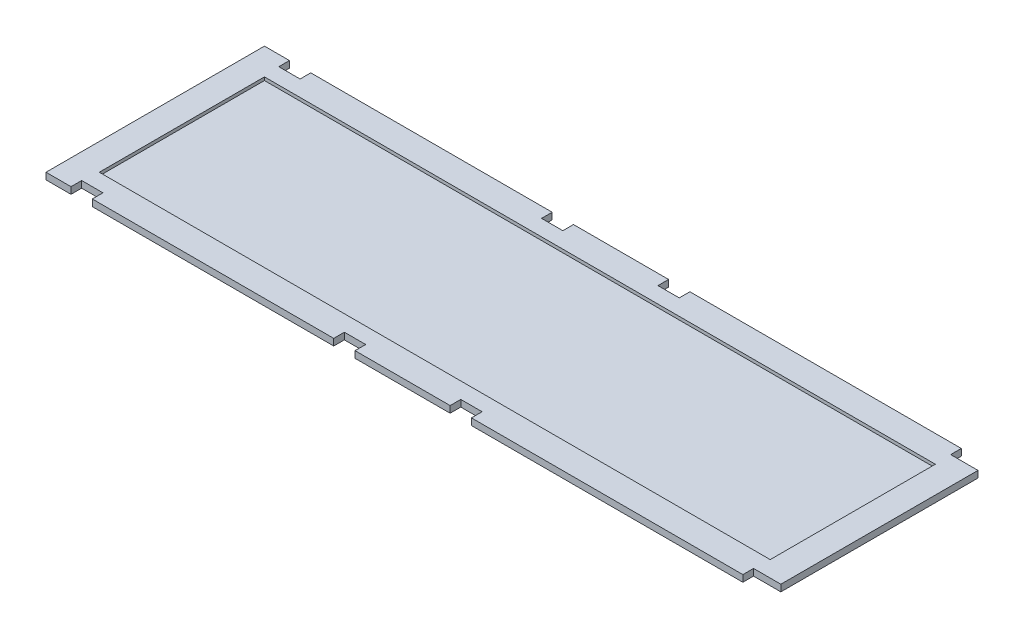
ISO-10303-21;
HEADER;
FILE_DESCRIPTION(('STEP AP214'),'2;1');
FILE_NAME('part.step','',(''),(''),'','','');
FILE_SCHEMA(('AUTOMOTIVE_DESIGN { 1 0 10303 214 1 1 1 1 }'));
ENDSEC;
DATA;
#1=APPLICATION_CONTEXT('core data for automotive mechanical design processes');
#2=APPLICATION_PROTOCOL_DEFINITION('international standard','automotive_design',2000,#1);
#3=PRODUCT_CONTEXT('',#1,'mechanical');
#4=PRODUCT('Part','Part','',(#3));
#5=PRODUCT_RELATED_PRODUCT_CATEGORY('part','',(#4));
#6=PRODUCT_DEFINITION_FORMATION('','',#4);
#7=PRODUCT_DEFINITION_CONTEXT('part definition',#1,'design');
#8=PRODUCT_DEFINITION('design','',#6,#7);
#9=PRODUCT_DEFINITION_SHAPE('','',#8);
#10=(LENGTH_UNIT() NAMED_UNIT(*) SI_UNIT(.MILLI.,.METRE.));
#11=(NAMED_UNIT(*) PLANE_ANGLE_UNIT() SI_UNIT($,.RADIAN.));
#12=(NAMED_UNIT(*) SI_UNIT($,.STERADIAN.) SOLID_ANGLE_UNIT());
#13=UNCERTAINTY_MEASURE_WITH_UNIT(LENGTH_MEASURE(1.E-05),#10,'distance_accuracy_value','');
#14=(GEOMETRIC_REPRESENTATION_CONTEXT(3) GLOBAL_UNCERTAINTY_ASSIGNED_CONTEXT((#13)) GLOBAL_UNIT_ASSIGNED_CONTEXT((#10,
#11,#12)) REPRESENTATION_CONTEXT('',''));
#15=CARTESIAN_POINT('',(0.,0.,0.));
#16=DIRECTION('',(0.,0.,1.));
#17=DIRECTION('',(1.,0.,0.));
#18=AXIS2_PLACEMENT_3D('',#15,#16,#17);
#19=CARTESIAN_POINT('',(0.,1.25,0.));
#20=DIRECTION('',(1.,0.,0.));
#21=DIRECTION('',(0.,0.,-1.));
#22=AXIS2_PLACEMENT_3D('',#19,#20,#21);
#23=PLANE('',#22);
#24=DIRECTION('',(0.,0.,1.));
#25=VECTOR('',#24,1.);
#26=CARTESIAN_POINT('',(0.,0.,0.));
#27=LINE('',#26,#25);
#28=CARTESIAN_POINT('',(0.,0.,-41.));
#29=VERTEX_POINT('',#28);
#30=CARTESIAN_POINT('',(0.,0.,0.));
#31=VERTEX_POINT('',#30);
#32=EDGE_CURVE('E285',#29,#31,#27,.T.);
#33=ORIENTED_EDGE('',*,*,#32,.T.);
#34=DIRECTION('',(0.,-1.,0.));
#35=VECTOR('',#34,1.);
#36=CARTESIAN_POINT('',(0.,1.25,0.));
#37=LINE('',#36,#35);
#38=CARTESIAN_POINT('',(0.,1.25,0.));
#39=VERTEX_POINT('',#38);
#40=EDGE_CURVE('E11',#39,#31,#37,.T.);
#41=ORIENTED_EDGE('',*,*,#40,.F.);
#42=DIRECTION('',(0.,0.,1.));
#43=VECTOR('',#42,1.);
#44=CARTESIAN_POINT('',(0.,1.25,0.));
#45=LINE('',#44,#43);
#46=CARTESIAN_POINT('',(0.,1.25,-41.));
#47=VERTEX_POINT('',#46);
#48=EDGE_CURVE('E349',#47,#39,#45,.T.);
#49=ORIENTED_EDGE('',*,*,#48,.F.);
#50=DIRECTION('',(0.,-1.,0.));
#51=VECTOR('',#50,1.);
#52=CARTESIAN_POINT('',(0.,1.25,-41.));
#53=LINE('',#52,#51);
#54=EDGE_CURVE('E281',#47,#29,#53,.T.);
#55=ORIENTED_EDGE('',*,*,#54,.T.);
#56=EDGE_LOOP('',(#33,#41,#49,#55));
#57=FACE_BOUND('',#56,.T.);
#58=ADVANCED_FACE('F33',(#57),#23,.F.);
#59=CARTESIAN_POINT('',(0.,1.25,0.));
#60=DIRECTION('',(0.,0.,-1.));
#61=DIRECTION('',(-1.,0.,0.));
#62=AXIS2_PLACEMENT_3D('',#59,#60,#61);
#63=PLANE('',#62);
#64=DIRECTION('',(1.,0.,0.));
#65=VECTOR('',#64,1.);
#66=CARTESIAN_POINT('',(0.,0.,0.));
#67=LINE('',#66,#65);
#68=CARTESIAN_POINT('',(4.69,0.,0.));
#69=VERTEX_POINT('',#68);
#70=EDGE_CURVE('E288',#31,#69,#67,.T.);
#71=ORIENTED_EDGE('',*,*,#70,.T.);
#72=DIRECTION('',(0.,-1.,0.));
#73=VECTOR('',#72,1.);
#74=CARTESIAN_POINT('',(4.69,1.25,0.));
#75=LINE('',#74,#73);
#76=CARTESIAN_POINT('',(4.69,1.25,0.));
#77=VERTEX_POINT('',#76);
#78=EDGE_CURVE('E40',#77,#69,#75,.T.);
#79=ORIENTED_EDGE('',*,*,#78,.F.);
#80=DIRECTION('',(1.,0.,0.));
#81=VECTOR('',#80,1.);
#82=CARTESIAN_POINT('',(0.,1.25,0.));
#83=LINE('',#82,#81);
#84=EDGE_CURVE('E169',#39,#77,#83,.T.);
#85=ORIENTED_EDGE('',*,*,#84,.F.);
#86=ORIENTED_EDGE('',*,*,#40,.T.);
#87=EDGE_LOOP('',(#71,#79,#85,#86));
#88=FACE_BOUND('',#87,.T.);
#89=ADVANCED_FACE('F590',(#88),#63,.F.);
#90=CARTESIAN_POINT('',(4.69,1.25,0.));
#91=DIRECTION('',(-1.,0.,0.));
#92=DIRECTION('',(0.,0.,1.));
#93=AXIS2_PLACEMENT_3D('',#90,#91,#92);
#94=PLANE('',#93);
#95=DIRECTION('',(0.,0.,-1.));
#96=VECTOR('',#95,1.);
#97=CARTESIAN_POINT('',(4.69,0.,0.));
#98=LINE('',#97,#96);
#99=CARTESIAN_POINT('',(4.69,0.,-2.));
#100=VERTEX_POINT('',#99);
#101=EDGE_CURVE('E291',#69,#100,#98,.T.);
#102=ORIENTED_EDGE('',*,*,#101,.T.);
#103=DIRECTION('',(0.,-1.,0.));
#104=VECTOR('',#103,1.);
#105=CARTESIAN_POINT('',(4.69,1.25,-2.));
#106=LINE('',#105,#104);
#107=CARTESIAN_POINT('',(4.69,1.25,-2.));
#108=VERTEX_POINT('',#107);
#109=EDGE_CURVE('E428',#108,#100,#106,.T.);
#110=ORIENTED_EDGE('',*,*,#109,.F.);
#111=DIRECTION('',(0.,0.,-1.));
#112=VECTOR('',#111,1.);
#113=CARTESIAN_POINT('',(4.69,1.25,0.));
#114=LINE('',#113,#112);
#115=EDGE_CURVE('E436',#77,#108,#114,.T.);
#116=ORIENTED_EDGE('',*,*,#115,.F.);
#117=ORIENTED_EDGE('',*,*,#78,.T.);
#118=EDGE_LOOP('',(#102,#110,#116,#117));
#119=FACE_BOUND('',#118,.T.);
#120=ADVANCED_FACE('F434',(#119),#94,.F.);
#121=CARTESIAN_POINT('',(4.69,1.25,-2.));
#122=DIRECTION('',(0.,0.,-1.));
#123=DIRECTION('',(-1.,0.,0.));
#124=AXIS2_PLACEMENT_3D('',#121,#122,#123);
#125=PLANE('',#124);
#126=DIRECTION('',(1.,0.,0.));
#127=VECTOR('',#126,1.);
#128=CARTESIAN_POINT('',(4.69,0.,-2.));
#129=LINE('',#128,#127);
#130=CARTESIAN_POINT('',(8.69,0.,-2.));
#131=VERTEX_POINT('',#130);
#132=EDGE_CURVE('E293',#100,#131,#129,.T.);
#133=ORIENTED_EDGE('',*,*,#132,.T.);
#134=DIRECTION('',(0.,-1.,0.));
#135=VECTOR('',#134,1.);
#136=CARTESIAN_POINT('',(8.69,1.25,-2.));
#137=LINE('',#136,#135);
#138=CARTESIAN_POINT('',(8.69,1.25,-2.));
#139=VERTEX_POINT('',#138);
#140=EDGE_CURVE('E425',#139,#131,#137,.T.);
#141=ORIENTED_EDGE('',*,*,#140,.F.);
#142=DIRECTION('',(1.,0.,0.));
#143=VECTOR('',#142,1.);
#144=CARTESIAN_POINT('',(4.69,1.25,-2.));
#145=LINE('',#144,#143);
#146=EDGE_CURVE('E454',#108,#139,#145,.T.);
#147=ORIENTED_EDGE('',*,*,#146,.F.);
#148=ORIENTED_EDGE('',*,*,#109,.T.);
#149=EDGE_LOOP('',(#133,#141,#147,#148));
#150=FACE_BOUND('',#149,.T.);
#151=ADVANCED_FACE('F445',(#150),#125,.F.);
#152=CARTESIAN_POINT('',(8.69,1.25,0.));
#153=DIRECTION('',(1.,0.,0.));
#154=DIRECTION('',(0.,0.,-1.));
#155=AXIS2_PLACEMENT_3D('',#152,#153,#154);
#156=PLANE('',#155);
#157=DIRECTION('',(0.,0.,1.));
#158=VECTOR('',#157,1.);
#159=CARTESIAN_POINT('',(8.69,0.,0.));
#160=LINE('',#159,#158);
#161=CARTESIAN_POINT('',(8.69,0.,0.));
#162=VERTEX_POINT('',#161);
#163=EDGE_CURVE('E295',#131,#162,#160,.T.);
#164=ORIENTED_EDGE('',*,*,#163,.T.);
#165=DIRECTION('',(0.,-1.,0.));
#166=VECTOR('',#165,1.);
#167=CARTESIAN_POINT('',(8.69,1.25,0.));
#168=LINE('',#167,#166);
#169=CARTESIAN_POINT('',(8.69,1.25,0.));
#170=VERTEX_POINT('',#169);
#171=EDGE_CURVE('E422',#170,#162,#168,.T.);
#172=ORIENTED_EDGE('',*,*,#171,.F.);
#173=DIRECTION('',(0.,0.,1.));
#174=VECTOR('',#173,1.);
#175=CARTESIAN_POINT('',(8.69,1.25,0.));
#176=LINE('',#175,#174);
#177=EDGE_CURVE('E451',#139,#170,#176,.T.);
#178=ORIENTED_EDGE('',*,*,#177,.F.);
#179=ORIENTED_EDGE('',*,*,#140,.T.);
#180=EDGE_LOOP('',(#164,#172,#178,#179));
#181=FACE_BOUND('',#180,.T.);
#182=ADVANCED_FACE('F449',(#181),#156,.F.);
#183=CARTESIAN_POINT('',(8.69,1.25,0.));
#184=DIRECTION('',(0.,0.,-1.));
#185=DIRECTION('',(-1.,0.,0.));
#186=AXIS2_PLACEMENT_3D('',#183,#184,#185);
#187=PLANE('',#186);
#188=DIRECTION('',(1.,0.,0.));
#189=VECTOR('',#188,1.);
#190=CARTESIAN_POINT('',(8.69,0.,0.));
#191=LINE('',#190,#189);
#192=CARTESIAN_POINT('',(54.,0.,0.));
#193=VERTEX_POINT('',#192);
#194=EDGE_CURVE('E297',#162,#193,#191,.T.);
#195=ORIENTED_EDGE('',*,*,#194,.T.);
#196=DIRECTION('',(0.,-1.,0.));
#197=VECTOR('',#196,1.);
#198=CARTESIAN_POINT('',(54.,1.25,0.));
#199=LINE('',#198,#197);
#200=CARTESIAN_POINT('',(54.,1.25,0.));
#201=VERTEX_POINT('',#200);
#202=EDGE_CURVE('E419',#201,#193,#199,.T.);
#203=ORIENTED_EDGE('',*,*,#202,.F.);
#204=DIRECTION('',(1.,0.,0.));
#205=VECTOR('',#204,1.);
#206=CARTESIAN_POINT('',(8.69,1.25,0.));
#207=LINE('',#206,#205);
#208=EDGE_CURVE('E453',#170,#201,#207,.T.);
#209=ORIENTED_EDGE('',*,*,#208,.F.);
#210=ORIENTED_EDGE('',*,*,#171,.T.);
#211=EDGE_LOOP('',(#195,#203,#209,#210));
#212=FACE_BOUND('',#211,.T.);
#213=ADVANCED_FACE('F603',(#212),#187,.F.);
#214=CARTESIAN_POINT('',(54.,1.25,0.));
#215=DIRECTION('',(-1.,0.,0.));
#216=DIRECTION('',(0.,0.,1.));
#217=AXIS2_PLACEMENT_3D('',#214,#215,#216);
#218=PLANE('',#217);
#219=DIRECTION('',(0.,0.,-1.));
#220=VECTOR('',#219,1.);
#221=CARTESIAN_POINT('',(54.,0.,0.));
#222=LINE('',#221,#220);
#223=CARTESIAN_POINT('',(54.,0.,-2.));
#224=VERTEX_POINT('',#223);
#225=EDGE_CURVE('E299',#193,#224,#222,.T.);
#226=ORIENTED_EDGE('',*,*,#225,.T.);
#227=DIRECTION('',(0.,-1.,0.));
#228=VECTOR('',#227,1.);
#229=CARTESIAN_POINT('',(54.,1.25,-2.));
#230=LINE('',#229,#228);
#231=CARTESIAN_POINT('',(54.,1.25,-2.));
#232=VERTEX_POINT('',#231);
#233=EDGE_CURVE('E416',#232,#224,#230,.T.);
#234=ORIENTED_EDGE('',*,*,#233,.F.);
#235=DIRECTION('',(0.,0.,-1.));
#236=VECTOR('',#235,1.);
#237=CARTESIAN_POINT('',(54.,1.25,0.));
#238=LINE('',#237,#236);
#239=EDGE_CURVE('E456',#201,#232,#238,.T.);
#240=ORIENTED_EDGE('',*,*,#239,.F.);
#241=ORIENTED_EDGE('',*,*,#202,.T.);
#242=EDGE_LOOP('',(#226,#234,#240,#241));
#243=FACE_BOUND('',#242,.T.);
#244=ADVANCED_FACE('F606',(#243),#218,.F.);
#245=CARTESIAN_POINT('',(54.,1.25,-2.));
#246=DIRECTION('',(0.,0.,-1.));
#247=DIRECTION('',(-1.,0.,0.));
#248=AXIS2_PLACEMENT_3D('',#245,#246,#247);
#249=PLANE('',#248);
#250=DIRECTION('',(1.,0.,0.));
#251=VECTOR('',#250,1.);
#252=CARTESIAN_POINT('',(54.,0.,-2.));
#253=LINE('',#252,#251);
#254=CARTESIAN_POINT('',(58.,0.,-2.));
#255=VERTEX_POINT('',#254);
#256=EDGE_CURVE('E301',#224,#255,#253,.T.);
#257=ORIENTED_EDGE('',*,*,#256,.T.);
#258=DIRECTION('',(0.,-1.,0.));
#259=VECTOR('',#258,1.);
#260=CARTESIAN_POINT('',(58.,1.25,-2.));
#261=LINE('',#260,#259);
#262=CARTESIAN_POINT('',(58.,1.25,-2.));
#263=VERTEX_POINT('',#262);
#264=EDGE_CURVE('E413',#263,#255,#261,.T.);
#265=ORIENTED_EDGE('',*,*,#264,.F.);
#266=DIRECTION('',(1.,0.,0.));
#267=VECTOR('',#266,1.);
#268=CARTESIAN_POINT('',(54.,1.25,-2.));
#269=LINE('',#268,#267);
#270=EDGE_CURVE('E462',#232,#263,#269,.T.);
#271=ORIENTED_EDGE('',*,*,#270,.F.);
#272=ORIENTED_EDGE('',*,*,#233,.T.);
#273=EDGE_LOOP('',(#257,#265,#271,#272));
#274=FACE_BOUND('',#273,.T.);
#275=ADVANCED_FACE('F610',(#274),#249,.F.);
#276=CARTESIAN_POINT('',(58.,1.25,0.));
#277=DIRECTION('',(1.,0.,0.));
#278=DIRECTION('',(0.,0.,-1.));
#279=AXIS2_PLACEMENT_3D('',#276,#277,#278);
#280=PLANE('',#279);
#281=DIRECTION('',(0.,0.,1.));
#282=VECTOR('',#281,1.);
#283=CARTESIAN_POINT('',(58.,0.,0.));
#284=LINE('',#283,#282);
#285=CARTESIAN_POINT('',(58.,0.,0.));
#286=VERTEX_POINT('',#285);
#287=EDGE_CURVE('E303',#255,#286,#284,.T.);
#288=ORIENTED_EDGE('',*,*,#287,.T.);
#289=DIRECTION('',(0.,-1.,0.));
#290=VECTOR('',#289,1.);
#291=CARTESIAN_POINT('',(58.,1.25,0.));
#292=LINE('',#291,#290);
#293=CARTESIAN_POINT('',(58.,1.25,0.));
#294=VERTEX_POINT('',#293);
#295=EDGE_CURVE('E410',#294,#286,#292,.T.);
#296=ORIENTED_EDGE('',*,*,#295,.F.);
#297=DIRECTION('',(0.,0.,1.));
#298=VECTOR('',#297,1.);
#299=CARTESIAN_POINT('',(58.,1.25,0.));
#300=LINE('',#299,#298);
#301=EDGE_CURVE('E464',#263,#294,#300,.T.);
#302=ORIENTED_EDGE('',*,*,#301,.F.);
#303=ORIENTED_EDGE('',*,*,#264,.T.);
#304=EDGE_LOOP('',(#288,#296,#302,#303));
#305=FACE_BOUND('',#304,.T.);
#306=ADVANCED_FACE('F614',(#305),#280,.F.);
#307=CARTESIAN_POINT('',(58.,1.25,0.));
#308=DIRECTION('',(0.,0.,-1.));
#309=DIRECTION('',(-1.,0.,0.));
#310=AXIS2_PLACEMENT_3D('',#307,#308,#309);
#311=PLANE('',#310);
#312=DIRECTION('',(1.,0.,0.));
#313=VECTOR('',#312,1.);
#314=CARTESIAN_POINT('',(58.,0.,0.));
#315=LINE('',#314,#313);
#316=CARTESIAN_POINT('',(75.85,0.,0.));
#317=VERTEX_POINT('',#316);
#318=EDGE_CURVE('E305',#286,#317,#315,.T.);
#319=ORIENTED_EDGE('',*,*,#318,.T.);
#320=DIRECTION('',(0.,-1.,0.));
#321=VECTOR('',#320,1.);
#322=CARTESIAN_POINT('',(75.85,1.25,0.));
#323=LINE('',#322,#321);
#324=CARTESIAN_POINT('',(75.85,1.25,0.));
#325=VERTEX_POINT('',#324);
#326=EDGE_CURVE('E407',#325,#317,#323,.T.);
#327=ORIENTED_EDGE('',*,*,#326,.F.);
#328=DIRECTION('',(1.,0.,0.));
#329=VECTOR('',#328,1.);
#330=CARTESIAN_POINT('',(58.,1.25,0.));
#331=LINE('',#330,#329);
#332=EDGE_CURVE('E466',#294,#325,#331,.T.);
#333=ORIENTED_EDGE('',*,*,#332,.F.);
#334=ORIENTED_EDGE('',*,*,#295,.T.);
#335=EDGE_LOOP('',(#319,#327,#333,#334));
#336=FACE_BOUND('',#335,.T.);
#337=ADVANCED_FACE('F618',(#336),#311,.F.);
#338=CARTESIAN_POINT('',(75.85,1.25,0.));
#339=DIRECTION('',(-1.,0.,0.));
#340=DIRECTION('',(0.,0.,1.));
#341=AXIS2_PLACEMENT_3D('',#338,#339,#340);
#342=PLANE('',#341);
#343=DIRECTION('',(0.,0.,-1.));
#344=VECTOR('',#343,1.);
#345=CARTESIAN_POINT('',(75.85,0.,0.));
#346=LINE('',#345,#344);
#347=CARTESIAN_POINT('',(75.85,0.,-2.));
#348=VERTEX_POINT('',#347);
#349=EDGE_CURVE('E307',#317,#348,#346,.T.);
#350=ORIENTED_EDGE('',*,*,#349,.T.);
#351=DIRECTION('',(0.,-1.,0.));
#352=VECTOR('',#351,1.);
#353=CARTESIAN_POINT('',(75.85,1.25,-2.));
#354=LINE('',#353,#352);
#355=CARTESIAN_POINT('',(75.85,1.25,-2.));
#356=VERTEX_POINT('',#355);
#357=EDGE_CURVE('E404',#356,#348,#354,.T.);
#358=ORIENTED_EDGE('',*,*,#357,.F.);
#359=DIRECTION('',(0.,0.,-1.));
#360=VECTOR('',#359,1.);
#361=CARTESIAN_POINT('',(75.85,1.25,0.));
#362=LINE('',#361,#360);
#363=EDGE_CURVE('E468',#325,#356,#362,.T.);
#364=ORIENTED_EDGE('',*,*,#363,.F.);
#365=ORIENTED_EDGE('',*,*,#326,.T.);
#366=EDGE_LOOP('',(#350,#358,#364,#365));
#367=FACE_BOUND('',#366,.T.);
#368=ADVANCED_FACE('F622',(#367),#342,.F.);
#369=CARTESIAN_POINT('',(75.85,1.25,-2.));
#370=DIRECTION('',(0.,0.,-1.));
#371=DIRECTION('',(-1.,0.,0.));
#372=AXIS2_PLACEMENT_3D('',#369,#370,#371);
#373=PLANE('',#372);
#374=DIRECTION('',(1.,0.,0.));
#375=VECTOR('',#374,1.);
#376=CARTESIAN_POINT('',(75.85,0.,-2.));
#377=LINE('',#376,#375);
#378=CARTESIAN_POINT('',(79.85,0.,-2.));
#379=VERTEX_POINT('',#378);
#380=EDGE_CURVE('E309',#348,#379,#377,.T.);
#381=ORIENTED_EDGE('',*,*,#380,.T.);
#382=DIRECTION('',(0.,-1.,0.));
#383=VECTOR('',#382,1.);
#384=CARTESIAN_POINT('',(79.85,1.25,-2.));
#385=LINE('',#384,#383);
#386=CARTESIAN_POINT('',(79.85,1.25,-2.));
#387=VERTEX_POINT('',#386);
#388=EDGE_CURVE('E401',#387,#379,#385,.T.);
#389=ORIENTED_EDGE('',*,*,#388,.F.);
#390=DIRECTION('',(1.,0.,0.));
#391=VECTOR('',#390,1.);
#392=CARTESIAN_POINT('',(75.85,1.25,-2.));
#393=LINE('',#392,#391);
#394=EDGE_CURVE('E470',#356,#387,#393,.T.);
#395=ORIENTED_EDGE('',*,*,#394,.F.);
#396=ORIENTED_EDGE('',*,*,#357,.T.);
#397=EDGE_LOOP('',(#381,#389,#395,#396));
#398=FACE_BOUND('',#397,.T.);
#399=ADVANCED_FACE('F626',(#398),#373,.F.);
#400=CARTESIAN_POINT('',(79.85,1.25,0.));
#401=DIRECTION('',(1.,0.,0.));
#402=DIRECTION('',(0.,0.,-1.));
#403=AXIS2_PLACEMENT_3D('',#400,#401,#402);
#404=PLANE('',#403);
#405=DIRECTION('',(0.,0.,1.));
#406=VECTOR('',#405,1.);
#407=CARTESIAN_POINT('',(79.85,0.,0.));
#408=LINE('',#407,#406);
#409=CARTESIAN_POINT('',(79.85,0.,0.));
#410=VERTEX_POINT('',#409);
#411=EDGE_CURVE('E311',#379,#410,#408,.T.);
#412=ORIENTED_EDGE('',*,*,#411,.T.);
#413=DIRECTION('',(0.,-1.,0.));
#414=VECTOR('',#413,1.);
#415=CARTESIAN_POINT('',(79.85,1.25,0.));
#416=LINE('',#415,#414);
#417=CARTESIAN_POINT('',(79.85,1.25,0.));
#418=VERTEX_POINT('',#417);
#419=EDGE_CURVE('E398',#418,#410,#416,.T.);
#420=ORIENTED_EDGE('',*,*,#419,.F.);
#421=DIRECTION('',(0.,0.,1.));
#422=VECTOR('',#421,1.);
#423=CARTESIAN_POINT('',(79.85,1.25,0.));
#424=LINE('',#423,#422);
#425=EDGE_CURVE('E472',#387,#418,#424,.T.);
#426=ORIENTED_EDGE('',*,*,#425,.F.);
#427=ORIENTED_EDGE('',*,*,#388,.T.);
#428=EDGE_LOOP('',(#412,#420,#426,#427));
#429=FACE_BOUND('',#428,.T.);
#430=ADVANCED_FACE('F630',(#429),#404,.F.);
#431=CARTESIAN_POINT('',(79.85,1.25,0.));
#432=DIRECTION('',(0.,0.,-1.));
#433=DIRECTION('',(-1.,0.,0.));
#434=AXIS2_PLACEMENT_3D('',#431,#432,#433);
#435=PLANE('',#434);
#436=DIRECTION('',(1.,0.,0.));
#437=VECTOR('',#436,1.);
#438=CARTESIAN_POINT('',(79.85,0.,0.));
#439=LINE('',#438,#437);
#440=CARTESIAN_POINT('',(130.79,0.,0.));
#441=VERTEX_POINT('',#440);
#442=EDGE_CURVE('E313',#410,#441,#439,.T.);
#443=ORIENTED_EDGE('',*,*,#442,.T.);
#444=DIRECTION('',(0.,-1.,0.));
#445=VECTOR('',#444,1.);
#446=CARTESIAN_POINT('',(130.79,1.25,0.));
#447=LINE('',#446,#445);
#448=CARTESIAN_POINT('',(130.79,1.25,0.));
#449=VERTEX_POINT('',#448);
#450=EDGE_CURVE('E395',#449,#441,#447,.T.);
#451=ORIENTED_EDGE('',*,*,#450,.F.);
#452=DIRECTION('',(1.,0.,0.));
#453=VECTOR('',#452,1.);
#454=CARTESIAN_POINT('',(79.85,1.25,0.));
#455=LINE('',#454,#453);
#456=EDGE_CURVE('E474',#418,#449,#455,.T.);
#457=ORIENTED_EDGE('',*,*,#456,.F.);
#458=ORIENTED_EDGE('',*,*,#419,.T.);
#459=EDGE_LOOP('',(#443,#451,#457,#458));
#460=FACE_BOUND('',#459,.T.);
#461=ADVANCED_FACE('F634',(#460),#435,.F.);
#462=CARTESIAN_POINT('',(130.79,1.25,0.));
#463=DIRECTION('',(-1.,0.,0.));
#464=DIRECTION('',(0.,0.,1.));
#465=AXIS2_PLACEMENT_3D('',#462,#463,#464);
#466=PLANE('',#465);
#467=DIRECTION('',(0.,0.,-1.));
#468=VECTOR('',#467,1.);
#469=CARTESIAN_POINT('',(130.79,0.,0.));
#470=LINE('',#469,#468);
#471=CARTESIAN_POINT('',(130.79,0.,-2.));
#472=VERTEX_POINT('',#471);
#473=EDGE_CURVE('E315',#441,#472,#470,.T.);
#474=ORIENTED_EDGE('',*,*,#473,.T.);
#475=DIRECTION('',(0.,-1.,0.));
#476=VECTOR('',#475,1.);
#477=CARTESIAN_POINT('',(130.79,1.25,-2.));
#478=LINE('',#477,#476);
#479=CARTESIAN_POINT('',(130.79,1.25,-2.));
#480=VERTEX_POINT('',#479);
#481=EDGE_CURVE('E392',#480,#472,#478,.T.);
#482=ORIENTED_EDGE('',*,*,#481,.F.);
#483=DIRECTION('',(0.,0.,-1.));
#484=VECTOR('',#483,1.);
#485=CARTESIAN_POINT('',(130.79,1.25,0.));
#486=LINE('',#485,#484);
#487=EDGE_CURVE('E476',#449,#480,#486,.T.);
#488=ORIENTED_EDGE('',*,*,#487,.F.);
#489=ORIENTED_EDGE('',*,*,#450,.T.);
#490=EDGE_LOOP('',(#474,#482,#488,#489));
#491=FACE_BOUND('',#490,.T.);
#492=ADVANCED_FACE('F638',(#491),#466,.F.);
#493=CARTESIAN_POINT('',(130.79,1.25,-2.));
#494=DIRECTION('',(0.,0.,-1.));
#495=DIRECTION('',(-1.,0.,0.));
#496=AXIS2_PLACEMENT_3D('',#493,#494,#495);
#497=PLANE('',#496);
#498=DIRECTION('',(1.,0.,0.));
#499=VECTOR('',#498,1.);
#500=CARTESIAN_POINT('',(130.79,0.,-2.));
#501=LINE('',#500,#499);
#502=CARTESIAN_POINT('',(135.92,0.,-2.));
#503=VERTEX_POINT('',#502);
#504=EDGE_CURVE('E317',#472,#503,#501,.T.);
#505=ORIENTED_EDGE('',*,*,#504,.T.);
#506=DIRECTION('',(0.,-1.,0.));
#507=VECTOR('',#506,1.);
#508=CARTESIAN_POINT('',(135.92,1.25,-2.));
#509=LINE('',#508,#507);
#510=CARTESIAN_POINT('',(135.92,1.25,-2.));
#511=VERTEX_POINT('',#510);
#512=EDGE_CURVE('E389',#511,#503,#509,.T.);
#513=ORIENTED_EDGE('',*,*,#512,.F.);
#514=DIRECTION('',(1.,0.,0.));
#515=VECTOR('',#514,1.);
#516=CARTESIAN_POINT('',(130.79,1.25,-2.));
#517=LINE('',#516,#515);
#518=EDGE_CURVE('E478',#480,#511,#517,.T.);
#519=ORIENTED_EDGE('',*,*,#518,.F.);
#520=ORIENTED_EDGE('',*,*,#481,.T.);
#521=EDGE_LOOP('',(#505,#513,#519,#520));
#522=FACE_BOUND('',#521,.T.);
#523=ADVANCED_FACE('F642',(#522),#497,.F.);
#524=CARTESIAN_POINT('',(135.92,1.25,-2.));
#525=DIRECTION('',(-1.,0.,0.));
#526=DIRECTION('',(0.,0.,1.));
#527=AXIS2_PLACEMENT_3D('',#524,#525,#526);
#528=PLANE('',#527);
#529=DIRECTION('',(0.,0.,-1.));
#530=VECTOR('',#529,1.);
#531=CARTESIAN_POINT('',(135.92,0.,-2.));
#532=LINE('',#531,#530);
#533=CARTESIAN_POINT('',(135.92,0.,-39.));
#534=VERTEX_POINT('',#533);
#535=EDGE_CURVE('E319',#503,#534,#532,.T.);
#536=ORIENTED_EDGE('',*,*,#535,.T.);
#537=DIRECTION('',(0.,-1.,0.));
#538=VECTOR('',#537,1.);
#539=CARTESIAN_POINT('',(135.92,1.25,-39.));
#540=LINE('',#539,#538);
#541=CARTESIAN_POINT('',(135.92,1.25,-39.));
#542=VERTEX_POINT('',#541);
#543=EDGE_CURVE('E386',#542,#534,#540,.T.);
#544=ORIENTED_EDGE('',*,*,#543,.F.);
#545=DIRECTION('',(0.,0.,-1.));
#546=VECTOR('',#545,1.);
#547=CARTESIAN_POINT('',(135.92,1.25,-2.));
#548=LINE('',#547,#546);
#549=EDGE_CURVE('E480',#511,#542,#548,.T.);
#550=ORIENTED_EDGE('',*,*,#549,.F.);
#551=ORIENTED_EDGE('',*,*,#512,.T.);
#552=EDGE_LOOP('',(#536,#544,#550,#551));
#553=FACE_BOUND('',#552,.T.);
#554=ADVANCED_FACE('F646',(#553),#528,.F.);
#555=CARTESIAN_POINT('',(130.79,1.25,-39.));
#556=DIRECTION('',(0.,0.,1.));
#557=DIRECTION('',(1.,0.,0.));
#558=AXIS2_PLACEMENT_3D('',#555,#556,#557);
#559=PLANE('',#558);
#560=DIRECTION('',(-1.,0.,0.));
#561=VECTOR('',#560,1.);
#562=CARTESIAN_POINT('',(130.79,0.,-39.));
#563=LINE('',#562,#561);
#564=CARTESIAN_POINT('',(130.79,0.,-39.));
#565=VERTEX_POINT('',#564);
#566=EDGE_CURVE('E321',#534,#565,#563,.T.);
#567=ORIENTED_EDGE('',*,*,#566,.T.);
#568=DIRECTION('',(0.,-1.,0.));
#569=VECTOR('',#568,1.);
#570=CARTESIAN_POINT('',(130.79,1.25,-39.));
#571=LINE('',#570,#569);
#572=CARTESIAN_POINT('',(130.79,1.25,-39.));
#573=VERTEX_POINT('',#572);
#574=EDGE_CURVE('E383',#573,#565,#571,.T.);
#575=ORIENTED_EDGE('',*,*,#574,.F.);
#576=DIRECTION('',(-1.,0.,0.));
#577=VECTOR('',#576,1.);
#578=CARTESIAN_POINT('',(130.79,1.25,-39.));
#579=LINE('',#578,#577);
#580=EDGE_CURVE('E482',#542,#573,#579,.T.);
#581=ORIENTED_EDGE('',*,*,#580,.F.);
#582=ORIENTED_EDGE('',*,*,#543,.T.);
#583=EDGE_LOOP('',(#567,#575,#581,#582));
#584=FACE_BOUND('',#583,.T.);
#585=ADVANCED_FACE('F650',(#584),#559,.F.);
#586=CARTESIAN_POINT('',(130.79,1.25,-41.));
#587=DIRECTION('',(-1.,0.,0.));
#588=DIRECTION('',(0.,0.,1.));
#589=AXIS2_PLACEMENT_3D('',#586,#587,#588);
#590=PLANE('',#589);
#591=DIRECTION('',(0.,0.,-1.));
#592=VECTOR('',#591,1.);
#593=CARTESIAN_POINT('',(130.79,0.,-41.));
#594=LINE('',#593,#592);
#595=CARTESIAN_POINT('',(130.79,0.,-41.));
#596=VERTEX_POINT('',#595);
#597=EDGE_CURVE('E323',#565,#596,#594,.T.);
#598=ORIENTED_EDGE('',*,*,#597,.T.);
#599=DIRECTION('',(0.,-1.,0.));
#600=VECTOR('',#599,1.);
#601=CARTESIAN_POINT('',(130.79,1.25,-41.));
#602=LINE('',#601,#600);
#603=CARTESIAN_POINT('',(130.79,1.25,-41.));
#604=VERTEX_POINT('',#603);
#605=EDGE_CURVE('E380',#604,#596,#602,.T.);
#606=ORIENTED_EDGE('',*,*,#605,.F.);
#607=DIRECTION('',(0.,0.,-1.));
#608=VECTOR('',#607,1.);
#609=CARTESIAN_POINT('',(130.79,1.25,-41.));
#610=LINE('',#609,#608);
#611=EDGE_CURVE('E484',#573,#604,#610,.T.);
#612=ORIENTED_EDGE('',*,*,#611,.F.);
#613=ORIENTED_EDGE('',*,*,#574,.T.);
#614=EDGE_LOOP('',(#598,#606,#612,#613));
#615=FACE_BOUND('',#614,.T.);
#616=ADVANCED_FACE('F654',(#615),#590,.F.);
#617=CARTESIAN_POINT('',(79.85,1.25,-41.));
#618=DIRECTION('',(0.,0.,1.));
#619=DIRECTION('',(1.,0.,0.));
#620=AXIS2_PLACEMENT_3D('',#617,#618,#619);
#621=PLANE('',#620);
#622=DIRECTION('',(-1.,0.,0.));
#623=VECTOR('',#622,1.);
#624=CARTESIAN_POINT('',(79.85,0.,-41.));
#625=LINE('',#624,#623);
#626=CARTESIAN_POINT('',(79.85,0.,-41.));
#627=VERTEX_POINT('',#626);
#628=EDGE_CURVE('E325',#596,#627,#625,.T.);
#629=ORIENTED_EDGE('',*,*,#628,.T.);
#630=DIRECTION('',(0.,-1.,0.));
#631=VECTOR('',#630,1.);
#632=CARTESIAN_POINT('',(79.85,1.25,-41.));
#633=LINE('',#632,#631);
#634=CARTESIAN_POINT('',(79.85,1.25,-41.));
#635=VERTEX_POINT('',#634);
#636=EDGE_CURVE('E377',#635,#627,#633,.T.);
#637=ORIENTED_EDGE('',*,*,#636,.F.);
#638=DIRECTION('',(-1.,0.,0.));
#639=VECTOR('',#638,1.);
#640=CARTESIAN_POINT('',(79.85,1.25,-41.));
#641=LINE('',#640,#639);
#642=EDGE_CURVE('E486',#604,#635,#641,.T.);
#643=ORIENTED_EDGE('',*,*,#642,.F.);
#644=ORIENTED_EDGE('',*,*,#605,.T.);
#645=EDGE_LOOP('',(#629,#637,#643,#644));
#646=FACE_BOUND('',#645,.T.);
#647=ADVANCED_FACE('F658',(#646),#621,.F.);
#648=CARTESIAN_POINT('',(79.85,1.25,-41.));
#649=DIRECTION('',(1.,0.,0.));
#650=DIRECTION('',(0.,0.,-1.));
#651=AXIS2_PLACEMENT_3D('',#648,#649,#650);
#652=PLANE('',#651);
#653=DIRECTION('',(0.,0.,1.));
#654=VECTOR('',#653,1.);
#655=CARTESIAN_POINT('',(79.85,0.,-41.));
#656=LINE('',#655,#654);
#657=CARTESIAN_POINT('',(79.85,0.,-39.));
#658=VERTEX_POINT('',#657);
#659=EDGE_CURVE('E327',#627,#658,#656,.T.);
#660=ORIENTED_EDGE('',*,*,#659,.T.);
#661=DIRECTION('',(0.,-1.,0.));
#662=VECTOR('',#661,1.);
#663=CARTESIAN_POINT('',(79.85,1.25,-39.));
#664=LINE('',#663,#662);
#665=CARTESIAN_POINT('',(79.85,1.25,-39.));
#666=VERTEX_POINT('',#665);
#667=EDGE_CURVE('E374',#666,#658,#664,.T.);
#668=ORIENTED_EDGE('',*,*,#667,.F.);
#669=DIRECTION('',(0.,0.,1.));
#670=VECTOR('',#669,1.);
#671=CARTESIAN_POINT('',(79.85,1.25,-41.));
#672=LINE('',#671,#670);
#673=EDGE_CURVE('E488',#635,#666,#672,.T.);
#674=ORIENTED_EDGE('',*,*,#673,.F.);
#675=ORIENTED_EDGE('',*,*,#636,.T.);
#676=EDGE_LOOP('',(#660,#668,#674,#675));
#677=FACE_BOUND('',#676,.T.);
#678=ADVANCED_FACE('F662',(#677),#652,.F.);
#679=CARTESIAN_POINT('',(75.85,1.25,-39.));
#680=DIRECTION('',(0.,0.,1.));
#681=DIRECTION('',(1.,0.,0.));
#682=AXIS2_PLACEMENT_3D('',#679,#680,#681);
#683=PLANE('',#682);
#684=DIRECTION('',(-1.,0.,0.));
#685=VECTOR('',#684,1.);
#686=CARTESIAN_POINT('',(75.85,0.,-39.));
#687=LINE('',#686,#685);
#688=CARTESIAN_POINT('',(75.85,0.,-39.));
#689=VERTEX_POINT('',#688);
#690=EDGE_CURVE('E329',#658,#689,#687,.T.);
#691=ORIENTED_EDGE('',*,*,#690,.T.);
#692=DIRECTION('',(0.,-1.,0.));
#693=VECTOR('',#692,1.);
#694=CARTESIAN_POINT('',(75.85,1.25,-39.));
#695=LINE('',#694,#693);
#696=CARTESIAN_POINT('',(75.85,1.25,-39.));
#697=VERTEX_POINT('',#696);
#698=EDGE_CURVE('E371',#697,#689,#695,.T.);
#699=ORIENTED_EDGE('',*,*,#698,.F.);
#700=DIRECTION('',(-1.,0.,0.));
#701=VECTOR('',#700,1.);
#702=CARTESIAN_POINT('',(75.85,1.25,-39.));
#703=LINE('',#702,#701);
#704=EDGE_CURVE('E490',#666,#697,#703,.T.);
#705=ORIENTED_EDGE('',*,*,#704,.F.);
#706=ORIENTED_EDGE('',*,*,#667,.T.);
#707=EDGE_LOOP('',(#691,#699,#705,#706));
#708=FACE_BOUND('',#707,.T.);
#709=ADVANCED_FACE('F666',(#708),#683,.F.);
#710=CARTESIAN_POINT('',(75.85,1.25,-41.));
#711=DIRECTION('',(-1.,0.,0.));
#712=DIRECTION('',(0.,0.,1.));
#713=AXIS2_PLACEMENT_3D('',#710,#711,#712);
#714=PLANE('',#713);
#715=DIRECTION('',(0.,0.,-1.));
#716=VECTOR('',#715,1.);
#717=CARTESIAN_POINT('',(75.85,0.,-41.));
#718=LINE('',#717,#716);
#719=CARTESIAN_POINT('',(75.85,0.,-41.));
#720=VERTEX_POINT('',#719);
#721=EDGE_CURVE('E331',#689,#720,#718,.T.);
#722=ORIENTED_EDGE('',*,*,#721,.T.);
#723=DIRECTION('',(0.,-1.,0.));
#724=VECTOR('',#723,1.);
#725=CARTESIAN_POINT('',(75.85,1.25,-41.));
#726=LINE('',#725,#724);
#727=CARTESIAN_POINT('',(75.85,1.25,-41.));
#728=VERTEX_POINT('',#727);
#729=EDGE_CURVE('E368',#728,#720,#726,.T.);
#730=ORIENTED_EDGE('',*,*,#729,.F.);
#731=DIRECTION('',(0.,0.,-1.));
#732=VECTOR('',#731,1.);
#733=CARTESIAN_POINT('',(75.85,1.25,-41.));
#734=LINE('',#733,#732);
#735=EDGE_CURVE('E492',#697,#728,#734,.T.);
#736=ORIENTED_EDGE('',*,*,#735,.F.);
#737=ORIENTED_EDGE('',*,*,#698,.T.);
#738=EDGE_LOOP('',(#722,#730,#736,#737));
#739=FACE_BOUND('',#738,.T.);
#740=ADVANCED_FACE('F670',(#739),#714,.F.);
#741=CARTESIAN_POINT('',(58.,1.25,-41.));
#742=DIRECTION('',(0.,0.,1.));
#743=DIRECTION('',(1.,0.,0.));
#744=AXIS2_PLACEMENT_3D('',#741,#742,#743);
#745=PLANE('',#744);
#746=DIRECTION('',(-1.,0.,0.));
#747=VECTOR('',#746,1.);
#748=CARTESIAN_POINT('',(58.,0.,-41.));
#749=LINE('',#748,#747);
#750=CARTESIAN_POINT('',(58.,0.,-41.));
#751=VERTEX_POINT('',#750);
#752=EDGE_CURVE('E333',#720,#751,#749,.T.);
#753=ORIENTED_EDGE('',*,*,#752,.T.);
#754=DIRECTION('',(0.,-1.,0.));
#755=VECTOR('',#754,1.);
#756=CARTESIAN_POINT('',(58.,1.25,-41.));
#757=LINE('',#756,#755);
#758=CARTESIAN_POINT('',(58.,1.25,-41.));
#759=VERTEX_POINT('',#758);
#760=EDGE_CURVE('E365',#759,#751,#757,.T.);
#761=ORIENTED_EDGE('',*,*,#760,.F.);
#762=DIRECTION('',(-1.,0.,0.));
#763=VECTOR('',#762,1.);
#764=CARTESIAN_POINT('',(58.,1.25,-41.));
#765=LINE('',#764,#763);
#766=EDGE_CURVE('E494',#728,#759,#765,.T.);
#767=ORIENTED_EDGE('',*,*,#766,.F.);
#768=ORIENTED_EDGE('',*,*,#729,.T.);
#769=EDGE_LOOP('',(#753,#761,#767,#768));
#770=FACE_BOUND('',#769,.T.);
#771=ADVANCED_FACE('F674',(#770),#745,.F.);
#772=CARTESIAN_POINT('',(58.,1.25,-41.));
#773=DIRECTION('',(1.,0.,0.));
#774=DIRECTION('',(0.,0.,-1.));
#775=AXIS2_PLACEMENT_3D('',#772,#773,#774);
#776=PLANE('',#775);
#777=DIRECTION('',(0.,0.,1.));
#778=VECTOR('',#777,1.);
#779=CARTESIAN_POINT('',(58.,0.,-41.));
#780=LINE('',#779,#778);
#781=CARTESIAN_POINT('',(58.,0.,-39.));
#782=VERTEX_POINT('',#781);
#783=EDGE_CURVE('E335',#751,#782,#780,.T.);
#784=ORIENTED_EDGE('',*,*,#783,.T.);
#785=DIRECTION('',(0.,-1.,0.));
#786=VECTOR('',#785,1.);
#787=CARTESIAN_POINT('',(58.,1.25,-39.));
#788=LINE('',#787,#786);
#789=CARTESIAN_POINT('',(58.,1.25,-39.));
#790=VERTEX_POINT('',#789);
#791=EDGE_CURVE('E362',#790,#782,#788,.T.);
#792=ORIENTED_EDGE('',*,*,#791,.F.);
#793=DIRECTION('',(0.,0.,1.));
#794=VECTOR('',#793,1.);
#795=CARTESIAN_POINT('',(58.,1.25,-41.));
#796=LINE('',#795,#794);
#797=EDGE_CURVE('E496',#759,#790,#796,.T.);
#798=ORIENTED_EDGE('',*,*,#797,.F.);
#799=ORIENTED_EDGE('',*,*,#760,.T.);
#800=EDGE_LOOP('',(#784,#792,#798,#799));
#801=FACE_BOUND('',#800,.T.);
#802=ADVANCED_FACE('F678',(#801),#776,.F.);
#803=CARTESIAN_POINT('',(54.,1.25,-39.));
#804=DIRECTION('',(0.,0.,1.));
#805=DIRECTION('',(1.,0.,0.));
#806=AXIS2_PLACEMENT_3D('',#803,#804,#805);
#807=PLANE('',#806);
#808=DIRECTION('',(-1.,0.,0.));
#809=VECTOR('',#808,1.);
#810=CARTESIAN_POINT('',(54.,0.,-39.));
#811=LINE('',#810,#809);
#812=CARTESIAN_POINT('',(54.,0.,-39.));
#813=VERTEX_POINT('',#812);
#814=EDGE_CURVE('E337',#782,#813,#811,.T.);
#815=ORIENTED_EDGE('',*,*,#814,.T.);
#816=DIRECTION('',(0.,-1.,0.));
#817=VECTOR('',#816,1.);
#818=CARTESIAN_POINT('',(54.,1.25,-39.));
#819=LINE('',#818,#817);
#820=CARTESIAN_POINT('',(54.,1.25,-39.));
#821=VERTEX_POINT('',#820);
#822=EDGE_CURVE('E359',#821,#813,#819,.T.);
#823=ORIENTED_EDGE('',*,*,#822,.F.);
#824=DIRECTION('',(-1.,0.,0.));
#825=VECTOR('',#824,1.);
#826=CARTESIAN_POINT('',(54.,1.25,-39.));
#827=LINE('',#826,#825);
#828=EDGE_CURVE('E498',#790,#821,#827,.T.);
#829=ORIENTED_EDGE('',*,*,#828,.F.);
#830=ORIENTED_EDGE('',*,*,#791,.T.);
#831=EDGE_LOOP('',(#815,#823,#829,#830));
#832=FACE_BOUND('',#831,.T.);
#833=ADVANCED_FACE('F682',(#832),#807,.F.);
#834=CARTESIAN_POINT('',(54.,1.25,-41.));
#835=DIRECTION('',(-1.,0.,0.));
#836=DIRECTION('',(0.,0.,1.));
#837=AXIS2_PLACEMENT_3D('',#834,#835,#836);
#838=PLANE('',#837);
#839=DIRECTION('',(0.,0.,-1.));
#840=VECTOR('',#839,1.);
#841=CARTESIAN_POINT('',(54.,0.,-41.));
#842=LINE('',#841,#840);
#843=CARTESIAN_POINT('',(54.,0.,-41.));
#844=VERTEX_POINT('',#843);
#845=EDGE_CURVE('E339',#813,#844,#842,.T.);
#846=ORIENTED_EDGE('',*,*,#845,.T.);
#847=DIRECTION('',(0.,-1.,0.));
#848=VECTOR('',#847,1.);
#849=CARTESIAN_POINT('',(54.,1.25,-41.));
#850=LINE('',#849,#848);
#851=CARTESIAN_POINT('',(54.,1.25,-41.));
#852=VERTEX_POINT('',#851);
#853=EDGE_CURVE('E356',#852,#844,#850,.T.);
#854=ORIENTED_EDGE('',*,*,#853,.F.);
#855=DIRECTION('',(0.,0.,-1.));
#856=VECTOR('',#855,1.);
#857=CARTESIAN_POINT('',(54.,1.25,-41.));
#858=LINE('',#857,#856);
#859=EDGE_CURVE('E500',#821,#852,#858,.T.);
#860=ORIENTED_EDGE('',*,*,#859,.F.);
#861=ORIENTED_EDGE('',*,*,#822,.T.);
#862=EDGE_LOOP('',(#846,#854,#860,#861));
#863=FACE_BOUND('',#862,.T.);
#864=ADVANCED_FACE('F686',(#863),#838,.F.);
#865=CARTESIAN_POINT('',(8.69,1.25,-41.));
#866=DIRECTION('',(0.,0.,1.));
#867=DIRECTION('',(1.,0.,0.));
#868=AXIS2_PLACEMENT_3D('',#865,#866,#867);
#869=PLANE('',#868);
#870=DIRECTION('',(-1.,0.,0.));
#871=VECTOR('',#870,1.);
#872=CARTESIAN_POINT('',(8.69,0.,-41.));
#873=LINE('',#872,#871);
#874=CARTESIAN_POINT('',(8.69,0.,-41.));
#875=VERTEX_POINT('',#874);
#876=EDGE_CURVE('E341',#844,#875,#873,.T.);
#877=ORIENTED_EDGE('',*,*,#876,.T.);
#878=DIRECTION('',(0.,-1.,0.));
#879=VECTOR('',#878,1.);
#880=CARTESIAN_POINT('',(8.69,1.25,-41.));
#881=LINE('',#880,#879);
#882=CARTESIAN_POINT('',(8.69,1.25,-41.));
#883=VERTEX_POINT('',#882);
#884=EDGE_CURVE('E353',#883,#875,#881,.T.);
#885=ORIENTED_EDGE('',*,*,#884,.F.);
#886=DIRECTION('',(-1.,0.,0.));
#887=VECTOR('',#886,1.);
#888=CARTESIAN_POINT('',(8.69,1.25,-41.));
#889=LINE('',#888,#887);
#890=EDGE_CURVE('E502',#852,#883,#889,.T.);
#891=ORIENTED_EDGE('',*,*,#890,.F.);
#892=ORIENTED_EDGE('',*,*,#853,.T.);
#893=EDGE_LOOP('',(#877,#885,#891,#892));
#894=FACE_BOUND('',#893,.T.);
#895=ADVANCED_FACE('F508',(#894),#869,.F.);
#896=CARTESIAN_POINT('',(8.69,1.25,-41.));
#897=DIRECTION('',(1.,0.,0.));
#898=DIRECTION('',(0.,0.,-1.));
#899=AXIS2_PLACEMENT_3D('',#896,#897,#898);
#900=PLANE('',#899);
#901=DIRECTION('',(0.,0.,1.));
#902=VECTOR('',#901,1.);
#903=CARTESIAN_POINT('',(8.69,0.,-41.));
#904=LINE('',#903,#902);
#905=CARTESIAN_POINT('',(8.69,0.,-39.));
#906=VERTEX_POINT('',#905);
#907=EDGE_CURVE('E343',#875,#906,#904,.T.);
#908=ORIENTED_EDGE('',*,*,#907,.T.);
#909=DIRECTION('',(0.,-1.,0.));
#910=VECTOR('',#909,1.);
#911=CARTESIAN_POINT('',(8.69,1.25,-39.));
#912=LINE('',#911,#910);
#913=CARTESIAN_POINT('',(8.69,1.25,-39.));
#914=VERTEX_POINT('',#913);
#915=EDGE_CURVE('E276',#914,#906,#912,.T.);
#916=ORIENTED_EDGE('',*,*,#915,.F.);
#917=DIRECTION('',(0.,0.,1.));
#918=VECTOR('',#917,1.);
#919=CARTESIAN_POINT('',(8.69,1.25,-41.));
#920=LINE('',#919,#918);
#921=EDGE_CURVE('E264',#883,#914,#920,.T.);
#922=ORIENTED_EDGE('',*,*,#921,.F.);
#923=ORIENTED_EDGE('',*,*,#884,.T.);
#924=EDGE_LOOP('',(#908,#916,#922,#923));
#925=FACE_BOUND('',#924,.T.);
#926=ADVANCED_FACE('F512',(#925),#900,.F.);
#927=CARTESIAN_POINT('',(4.69,1.25,-39.));
#928=DIRECTION('',(0.,0.,1.));
#929=DIRECTION('',(1.,0.,0.));
#930=AXIS2_PLACEMENT_3D('',#927,#928,#929);
#931=PLANE('',#930);
#932=DIRECTION('',(-1.,0.,0.));
#933=VECTOR('',#932,1.);
#934=CARTESIAN_POINT('',(4.69,0.,-39.));
#935=LINE('',#934,#933);
#936=CARTESIAN_POINT('',(4.69,0.,-39.));
#937=VERTEX_POINT('',#936);
#938=EDGE_CURVE('E273',#906,#937,#935,.T.);
#939=ORIENTED_EDGE('',*,*,#938,.T.);
#940=DIRECTION('',(0.,-1.,0.));
#941=VECTOR('',#940,1.);
#942=CARTESIAN_POINT('',(4.69,1.25,-39.));
#943=LINE('',#942,#941);
#944=CARTESIAN_POINT('',(4.69,1.25,-39.));
#945=VERTEX_POINT('',#944);
#946=EDGE_CURVE('E270',#945,#937,#943,.T.);
#947=ORIENTED_EDGE('',*,*,#946,.F.);
#948=DIRECTION('',(-1.,0.,0.));
#949=VECTOR('',#948,1.);
#950=CARTESIAN_POINT('',(4.69,1.25,-39.));
#951=LINE('',#950,#949);
#952=EDGE_CURVE('E257',#914,#945,#951,.T.);
#953=ORIENTED_EDGE('',*,*,#952,.F.);
#954=ORIENTED_EDGE('',*,*,#915,.T.);
#955=EDGE_LOOP('',(#939,#947,#953,#954));
#956=FACE_BOUND('',#955,.T.);
#957=ADVANCED_FACE('F271',(#956),#931,.F.);
#958=CARTESIAN_POINT('',(4.69,1.25,-41.));
#959=DIRECTION('',(-1.,0.,0.));
#960=DIRECTION('',(0.,0.,1.));
#961=AXIS2_PLACEMENT_3D('',#958,#959,#960);
#962=PLANE('',#961);
#963=DIRECTION('',(0.,0.,-1.));
#964=VECTOR('',#963,1.);
#965=CARTESIAN_POINT('',(4.69,0.,-41.));
#966=LINE('',#965,#964);
#967=CARTESIAN_POINT('',(4.69,0.,-41.));
#968=VERTEX_POINT('',#967);
#969=EDGE_CURVE('E346',#937,#968,#966,.T.);
#970=ORIENTED_EDGE('',*,*,#969,.T.);
#971=DIRECTION('',(0.,-1.,0.));
#972=VECTOR('',#971,1.);
#973=CARTESIAN_POINT('',(4.69,1.25,-41.));
#974=LINE('',#973,#972);
#975=CARTESIAN_POINT('',(4.69,1.25,-41.));
#976=VERTEX_POINT('',#975);
#977=EDGE_CURVE('E277',#976,#968,#974,.T.);
#978=ORIENTED_EDGE('',*,*,#977,.F.);
#979=DIRECTION('',(0.,0.,-1.));
#980=VECTOR('',#979,1.);
#981=CARTESIAN_POINT('',(4.69,1.25,-41.));
#982=LINE('',#981,#980);
#983=EDGE_CURVE('E261',#945,#976,#982,.T.);
#984=ORIENTED_EDGE('',*,*,#983,.F.);
#985=ORIENTED_EDGE('',*,*,#946,.T.);
#986=EDGE_LOOP('',(#970,#978,#984,#985));
#987=FACE_BOUND('',#986,.T.);
#988=ADVANCED_FACE('F279',(#987),#962,.F.);
#989=CARTESIAN_POINT('',(0.,1.25,-41.));
#990=DIRECTION('',(0.,0.,1.));
#991=DIRECTION('',(1.,0.,0.));
#992=AXIS2_PLACEMENT_3D('',#989,#990,#991);
#993=PLANE('',#992);
#994=DIRECTION('',(-1.,0.,0.));
#995=VECTOR('',#994,1.);
#996=CARTESIAN_POINT('',(0.,0.,-41.));
#997=LINE('',#996,#995);
#998=EDGE_CURVE('E161',#968,#29,#997,.T.);
#999=ORIENTED_EDGE('',*,*,#998,.T.);
#1000=ORIENTED_EDGE('',*,*,#54,.F.);
#1001=DIRECTION('',(-1.,0.,0.));
#1002=VECTOR('',#1001,1.);
#1003=CARTESIAN_POINT('',(0.,1.25,-41.));
#1004=LINE('',#1003,#1002);
#1005=EDGE_CURVE('E56',#976,#47,#1004,.T.);
#1006=ORIENTED_EDGE('',*,*,#1005,.F.);
#1007=ORIENTED_EDGE('',*,*,#977,.T.);
#1008=EDGE_LOOP('',(#999,#1000,#1006,#1007));
#1009=FACE_BOUND('',#1008,.T.);
#1010=ADVANCED_FACE('F513',(#1009),#993,.F.);
#1011=CARTESIAN_POINT('',(0.,1.25,0.));
#1012=DIRECTION('',(0.,-1.,0.));
#1013=DIRECTION('',(0.,0.,-1.));
#1014=AXIS2_PLACEMENT_3D('',#1011,#1012,#1013);
#1015=PLANE('',#1014);
#1016=DIRECTION('',(1.,0.,0.));
#1017=VECTOR('',#1016,1.);
#1018=CARTESIAN_POINT('',(5.,1.25,-5.));
#1019=LINE('',#1018,#1017);
#1020=CARTESIAN_POINT('',(5.,1.25,-5.));
#1021=VERTEX_POINT('',#1020);
#1022=CARTESIAN_POINT('',(130.92,1.25,-5.));
#1023=VERTEX_POINT('',#1022);
#1024=EDGE_CURVE('E537',#1021,#1023,#1019,.T.);
#1025=ORIENTED_EDGE('',*,*,#1024,.F.);
#1026=DIRECTION('',(0.,0.,1.));
#1027=VECTOR('',#1026,1.);
#1028=CARTESIAN_POINT('',(5.,1.25,-36.));
#1029=LINE('',#1028,#1027);
#1030=CARTESIAN_POINT('',(5.,1.25,-36.));
#1031=VERTEX_POINT('',#1030);
#1032=EDGE_CURVE('E47',#1031,#1021,#1029,.T.);
#1033=ORIENTED_EDGE('',*,*,#1032,.F.);
#1034=DIRECTION('',(-1.,0.,0.));
#1035=VECTOR('',#1034,1.);
#1036=CARTESIAN_POINT('',(5.,1.25,-36.));
#1037=LINE('',#1036,#1035);
#1038=CARTESIAN_POINT('',(130.92,1.25,-36.));
#1039=VERTEX_POINT('',#1038);
#1040=EDGE_CURVE('E530',#1039,#1031,#1037,.T.);
#1041=ORIENTED_EDGE('',*,*,#1040,.F.);
#1042=DIRECTION('',(0.,0.,-1.));
#1043=VECTOR('',#1042,1.);
#1044=CARTESIAN_POINT('',(130.92,1.25,-36.));
#1045=LINE('',#1044,#1043);
#1046=EDGE_CURVE('E534',#1023,#1039,#1045,.T.);
#1047=ORIENTED_EDGE('',*,*,#1046,.F.);
#1048=EDGE_LOOP('',(#1025,#1033,#1041,#1047));
#1049=FACE_BOUND('',#1048,.T.);
#1050=ORIENTED_EDGE('',*,*,#48,.T.);
#1051=ORIENTED_EDGE('',*,*,#84,.T.);
#1052=ORIENTED_EDGE('',*,*,#115,.T.);
#1053=ORIENTED_EDGE('',*,*,#146,.T.);
#1054=ORIENTED_EDGE('',*,*,#177,.T.);
#1055=ORIENTED_EDGE('',*,*,#208,.T.);
#1056=ORIENTED_EDGE('',*,*,#239,.T.);
#1057=ORIENTED_EDGE('',*,*,#270,.T.);
#1058=ORIENTED_EDGE('',*,*,#301,.T.);
#1059=ORIENTED_EDGE('',*,*,#332,.T.);
#1060=ORIENTED_EDGE('',*,*,#363,.T.);
#1061=ORIENTED_EDGE('',*,*,#394,.T.);
#1062=ORIENTED_EDGE('',*,*,#425,.T.);
#1063=ORIENTED_EDGE('',*,*,#456,.T.);
#1064=ORIENTED_EDGE('',*,*,#487,.T.);
#1065=ORIENTED_EDGE('',*,*,#518,.T.);
#1066=ORIENTED_EDGE('',*,*,#549,.T.);
#1067=ORIENTED_EDGE('',*,*,#580,.T.);
#1068=ORIENTED_EDGE('',*,*,#611,.T.);
#1069=ORIENTED_EDGE('',*,*,#642,.T.);
#1070=ORIENTED_EDGE('',*,*,#673,.T.);
#1071=ORIENTED_EDGE('',*,*,#704,.T.);
#1072=ORIENTED_EDGE('',*,*,#735,.T.);
#1073=ORIENTED_EDGE('',*,*,#766,.T.);
#1074=ORIENTED_EDGE('',*,*,#797,.T.);
#1075=ORIENTED_EDGE('',*,*,#828,.T.);
#1076=ORIENTED_EDGE('',*,*,#859,.T.);
#1077=ORIENTED_EDGE('',*,*,#890,.T.);
#1078=ORIENTED_EDGE('',*,*,#921,.T.);
#1079=ORIENTED_EDGE('',*,*,#952,.T.);
#1080=ORIENTED_EDGE('',*,*,#983,.T.);
#1081=ORIENTED_EDGE('',*,*,#1005,.T.);
#1082=EDGE_LOOP('',(#1050,#1051,#1052,#1053,#1054,#1055,#1056,#1057,#1058,#1059,#1060,#1061,
#1062,#1063,#1064,#1065,#1066,#1067,#1068,#1069,#1070,#1071,#1072,#1073,#1074,#1075,#1076,#1077,
#1078,#1079,#1080,#1081));
#1083=FACE_BOUND('',#1082,.T.);
#1084=ADVANCED_FACE('F259',(#1049,#1083),#1015,.F.);
#1085=CARTESIAN_POINT('',(0.,0.,0.));
#1086=DIRECTION('',(0.,-1.,0.));
#1087=DIRECTION('',(0.,0.,-1.));
#1088=AXIS2_PLACEMENT_3D('',#1085,#1086,#1087);
#1089=PLANE('',#1088);
#1090=ORIENTED_EDGE('',*,*,#32,.F.);
#1091=ORIENTED_EDGE('',*,*,#998,.F.);
#1092=ORIENTED_EDGE('',*,*,#969,.F.);
#1093=ORIENTED_EDGE('',*,*,#938,.F.);
#1094=ORIENTED_EDGE('',*,*,#907,.F.);
#1095=ORIENTED_EDGE('',*,*,#876,.F.);
#1096=ORIENTED_EDGE('',*,*,#845,.F.);
#1097=ORIENTED_EDGE('',*,*,#814,.F.);
#1098=ORIENTED_EDGE('',*,*,#783,.F.);
#1099=ORIENTED_EDGE('',*,*,#752,.F.);
#1100=ORIENTED_EDGE('',*,*,#721,.F.);
#1101=ORIENTED_EDGE('',*,*,#690,.F.);
#1102=ORIENTED_EDGE('',*,*,#659,.F.);
#1103=ORIENTED_EDGE('',*,*,#628,.F.);
#1104=ORIENTED_EDGE('',*,*,#597,.F.);
#1105=ORIENTED_EDGE('',*,*,#566,.F.);
#1106=ORIENTED_EDGE('',*,*,#535,.F.);
#1107=ORIENTED_EDGE('',*,*,#504,.F.);
#1108=ORIENTED_EDGE('',*,*,#473,.F.);
#1109=ORIENTED_EDGE('',*,*,#442,.F.);
#1110=ORIENTED_EDGE('',*,*,#411,.F.);
#1111=ORIENTED_EDGE('',*,*,#380,.F.);
#1112=ORIENTED_EDGE('',*,*,#349,.F.);
#1113=ORIENTED_EDGE('',*,*,#318,.F.);
#1114=ORIENTED_EDGE('',*,*,#287,.F.);
#1115=ORIENTED_EDGE('',*,*,#256,.F.);
#1116=ORIENTED_EDGE('',*,*,#225,.F.);
#1117=ORIENTED_EDGE('',*,*,#194,.F.);
#1118=ORIENTED_EDGE('',*,*,#163,.F.);
#1119=ORIENTED_EDGE('',*,*,#132,.F.);
#1120=ORIENTED_EDGE('',*,*,#101,.F.);
#1121=ORIENTED_EDGE('',*,*,#70,.F.);
#1122=EDGE_LOOP('',(#1090,#1091,#1092,#1093,#1094,#1095,#1096,#1097,#1098,#1099,#1100,#1101,
#1102,#1103,#1104,#1105,#1106,#1107,#1108,#1109,#1110,#1111,#1112,#1113,#1114,#1115,#1116,#1117,
#1118,#1119,#1120,#1121));
#1123=FACE_BOUND('',#1122,.T.);
#1124=ADVANCED_FACE('F440',(#1123),#1089,.T.);
#1125=CARTESIAN_POINT('',(5.,0.65,-36.));
#1126=DIRECTION('',(-1.,0.,0.));
#1127=DIRECTION('',(0.,0.,1.));
#1128=AXIS2_PLACEMENT_3D('',#1125,#1126,#1127);
#1129=PLANE('',#1128);
#1130=ORIENTED_EDGE('',*,*,#1032,.T.);
#1131=DIRECTION('',(0.,1.,0.));
#1132=VECTOR('',#1131,1.);
#1133=CARTESIAN_POINT('',(5.,0.65,-5.));
#1134=LINE('',#1133,#1132);
#1135=CARTESIAN_POINT('',(5.,0.65,-5.));
#1136=VERTEX_POINT('',#1135);
#1137=EDGE_CURVE('E520',#1136,#1021,#1134,.T.);
#1138=ORIENTED_EDGE('',*,*,#1137,.F.);
#1139=DIRECTION('',(0.,0.,1.));
#1140=VECTOR('',#1139,1.);
#1141=CARTESIAN_POINT('',(5.,0.65,-36.));
#1142=LINE('',#1141,#1140);
#1143=CARTESIAN_POINT('',(5.,0.65,-36.));
#1144=VERTEX_POINT('',#1143);
#1145=EDGE_CURVE('E533',#1144,#1136,#1142,.T.);
#1146=ORIENTED_EDGE('',*,*,#1145,.F.);
#1147=DIRECTION('',(0.,1.,0.));
#1148=VECTOR('',#1147,1.);
#1149=CARTESIAN_POINT('',(5.,0.65,-36.));
#1150=LINE('',#1149,#1148);
#1151=EDGE_CURVE('E289',#1144,#1031,#1150,.T.);
#1152=ORIENTED_EDGE('',*,*,#1151,.T.);
#1153=EDGE_LOOP('',(#1130,#1138,#1146,#1152));
#1154=FACE_BOUND('',#1153,.T.);
#1155=ADVANCED_FACE('F558',(#1154),#1129,.F.);
#1156=CARTESIAN_POINT('',(5.,0.65,-36.));
#1157=DIRECTION('',(0.,0.,-1.));
#1158=DIRECTION('',(-1.,0.,0.));
#1159=AXIS2_PLACEMENT_3D('',#1156,#1157,#1158);
#1160=PLANE('',#1159);
#1161=ORIENTED_EDGE('',*,*,#1040,.T.);
#1162=ORIENTED_EDGE('',*,*,#1151,.F.);
#1163=DIRECTION('',(-1.,0.,0.));
#1164=VECTOR('',#1163,1.);
#1165=CARTESIAN_POINT('',(5.,0.65,-36.));
#1166=LINE('',#1165,#1164);
#1167=CARTESIAN_POINT('',(130.92,0.65,-36.));
#1168=VERTEX_POINT('',#1167);
#1169=EDGE_CURVE('E523',#1168,#1144,#1166,.T.);
#1170=ORIENTED_EDGE('',*,*,#1169,.F.);
#1171=DIRECTION('',(0.,1.,0.));
#1172=VECTOR('',#1171,1.);
#1173=CARTESIAN_POINT('',(130.92,0.65,-36.));
#1174=LINE('',#1173,#1172);
#1175=EDGE_CURVE('E526',#1168,#1039,#1174,.T.);
#1176=ORIENTED_EDGE('',*,*,#1175,.T.);
#1177=EDGE_LOOP('',(#1161,#1162,#1170,#1176));
#1178=FACE_BOUND('',#1177,.T.);
#1179=ADVANCED_FACE('F569',(#1178),#1160,.F.);
#1180=CARTESIAN_POINT('',(130.92,0.65,-36.));
#1181=DIRECTION('',(1.,0.,0.));
#1182=DIRECTION('',(0.,0.,-1.));
#1183=AXIS2_PLACEMENT_3D('',#1180,#1181,#1182);
#1184=PLANE('',#1183);
#1185=ORIENTED_EDGE('',*,*,#1046,.T.);
#1186=ORIENTED_EDGE('',*,*,#1175,.F.);
#1187=DIRECTION('',(0.,0.,-1.));
#1188=VECTOR('',#1187,1.);
#1189=CARTESIAN_POINT('',(130.92,0.65,-36.));
#1190=LINE('',#1189,#1188);
#1191=CARTESIAN_POINT('',(130.92,0.65,-5.));
#1192=VERTEX_POINT('',#1191);
#1193=EDGE_CURVE('E543',#1192,#1168,#1190,.T.);
#1194=ORIENTED_EDGE('',*,*,#1193,.F.);
#1195=DIRECTION('',(0.,1.,0.));
#1196=VECTOR('',#1195,1.);
#1197=CARTESIAN_POINT('',(130.92,0.65,-5.));
#1198=LINE('',#1197,#1196);
#1199=EDGE_CURVE('E522',#1192,#1023,#1198,.T.);
#1200=ORIENTED_EDGE('',*,*,#1199,.T.);
#1201=EDGE_LOOP('',(#1185,#1186,#1194,#1200));
#1202=FACE_BOUND('',#1201,.T.);
#1203=ADVANCED_FACE('F574',(#1202),#1184,.F.);
#1204=CARTESIAN_POINT('',(5.,0.65,-5.));
#1205=DIRECTION('',(0.,0.,1.));
#1206=DIRECTION('',(1.,0.,0.));
#1207=AXIS2_PLACEMENT_3D('',#1204,#1205,#1206);
#1208=PLANE('',#1207);
#1209=ORIENTED_EDGE('',*,*,#1024,.T.);
#1210=ORIENTED_EDGE('',*,*,#1199,.F.);
#1211=DIRECTION('',(1.,0.,0.));
#1212=VECTOR('',#1211,1.);
#1213=CARTESIAN_POINT('',(5.,0.65,-5.));
#1214=LINE('',#1213,#1212);
#1215=EDGE_CURVE('E546',#1136,#1192,#1214,.T.);
#1216=ORIENTED_EDGE('',*,*,#1215,.F.);
#1217=ORIENTED_EDGE('',*,*,#1137,.T.);
#1218=EDGE_LOOP('',(#1209,#1210,#1216,#1217));
#1219=FACE_BOUND('',#1218,.T.);
#1220=ADVANCED_FACE('F579',(#1219),#1208,.F.);
#1221=CARTESIAN_POINT('',(0.,0.65,0.));
#1222=DIRECTION('',(0.,1.,0.));
#1223=DIRECTION('',(0.,0.,1.));
#1224=AXIS2_PLACEMENT_3D('',#1221,#1222,#1223);
#1225=PLANE('',#1224);
#1226=ORIENTED_EDGE('',*,*,#1145,.T.);
#1227=ORIENTED_EDGE('',*,*,#1215,.T.);
#1228=ORIENTED_EDGE('',*,*,#1193,.T.);
#1229=ORIENTED_EDGE('',*,*,#1169,.T.);
#1230=EDGE_LOOP('',(#1226,#1227,#1228,#1229));
#1231=FACE_BOUND('',#1230,.T.);
#1232=ADVANCED_FACE('F553',(#1231),#1225,.T.);
#1233=CLOSED_SHELL('',(#58,#89,#120,#151,#182,#213,#244,#275,#306,#337,#368,#399,#430,#461,#492,
#523,#554,#585,#616,#647,#678,#709,#740,#771,#802,#833,#864,#895,#926,#957,#988,#1010,#1084,
#1124,#1155,#1179,#1203,#1220,#1232));
#1234=MANIFOLD_SOLID_BREP('B2',#1233);
#1235=ADVANCED_BREP_SHAPE_REPRESENTATION('',(#18,#1234),#14);
#1236=SHAPE_DEFINITION_REPRESENTATION(#9,#1235);
ENDSEC;
END-ISO-10303-21;
